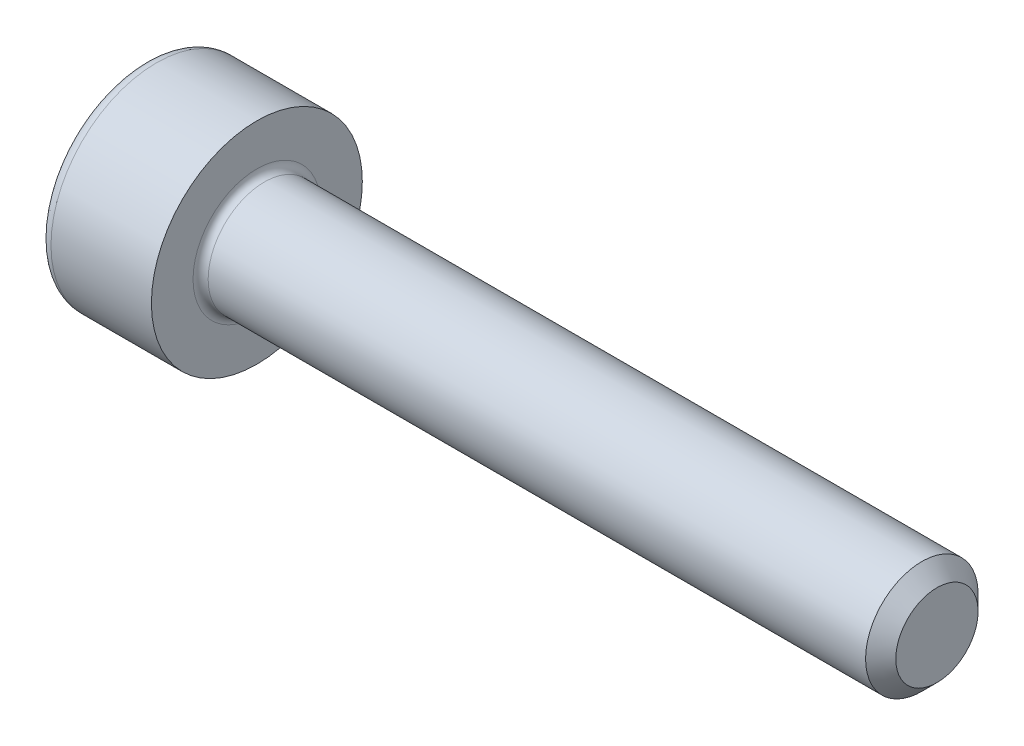
ISO-10303-21;
HEADER;
FILE_DESCRIPTION(('STEP AP214'),'2;1');
FILE_NAME('part.step','',(''),(''),'','','');
FILE_SCHEMA(('AUTOMOTIVE_DESIGN { 1 0 10303 214 1 1 1 1 }'));
ENDSEC;
DATA;
#1=APPLICATION_CONTEXT('core data for automotive mechanical design processes');
#2=APPLICATION_PROTOCOL_DEFINITION('international standard','automotive_design',2000,#1);
#3=PRODUCT_CONTEXT('',#1,'mechanical');
#4=PRODUCT('Part','Part','',(#3));
#5=PRODUCT_RELATED_PRODUCT_CATEGORY('part','',(#4));
#6=PRODUCT_DEFINITION_FORMATION('','',#4);
#7=PRODUCT_DEFINITION_CONTEXT('part definition',#1,'design');
#8=PRODUCT_DEFINITION('design','',#6,#7);
#9=PRODUCT_DEFINITION_SHAPE('','',#8);
#10=(LENGTH_UNIT() NAMED_UNIT(*) SI_UNIT(.MILLI.,.METRE.));
#11=(NAMED_UNIT(*) PLANE_ANGLE_UNIT() SI_UNIT($,.RADIAN.));
#12=(NAMED_UNIT(*) SI_UNIT($,.STERADIAN.) SOLID_ANGLE_UNIT());
#13=UNCERTAINTY_MEASURE_WITH_UNIT(LENGTH_MEASURE(1.E-05),#10,'distance_accuracy_value','');
#14=(GEOMETRIC_REPRESENTATION_CONTEXT(3) GLOBAL_UNCERTAINTY_ASSIGNED_CONTEXT((#13)) GLOBAL_UNIT_ASSIGNED_CONTEXT((#10,
#11,#12)) REPRESENTATION_CONTEXT('',''));
#15=CARTESIAN_POINT('',(0.,0.,0.));
#16=DIRECTION('',(0.,0.,1.));
#17=DIRECTION('',(1.,0.,0.));
#18=AXIS2_PLACEMENT_3D('',#15,#16,#17);
#19=CARTESIAN_POINT('',(0.,0.,0.));
#20=DIRECTION('',(-1.,0.,0.));
#21=DIRECTION('',(0.,0.,1.));
#22=AXIS2_PLACEMENT_3D('',#19,#20,#21);
#23=CYLINDRICAL_SURFACE('',#22,1.39568824458778);
#24=CARTESIAN_POINT('',(0.16,0.,0.));
#25=DIRECTION('',(1.,0.,0.));
#26=DIRECTION('',(0.,0.,-1.));
#27=AXIS2_PLACEMENT_3D('',#24,#25,#26);
#28=CIRCLE('',#27,1.39568824458778);
#29=CARTESIAN_POINT('',(0.16,0.,-1.39568824458778));
#30=VERTEX_POINT('',#29);
#31=EDGE_CURVE('E158',#30,#30,#28,.T.);
#32=ORIENTED_EDGE('',*,*,#31,.T.);
#33=EDGE_LOOP('',(#32));
#34=FACE_BOUND('',#33,.T.);
#35=CARTESIAN_POINT('',(1.48873412756029,0.,0.));
#36=DIRECTION('',(-1.,0.,0.));
#37=DIRECTION('',(0.,0.,1.));
#38=AXIS2_PLACEMENT_3D('',#35,#36,#37);
#39=CIRCLE('',#38,1.39568824458778);
#40=CARTESIAN_POINT('',(1.48873412756029,0.,1.39568824458778));
#41=VERTEX_POINT('',#40);
#42=EDGE_CURVE('E141',#41,#41,#39,.T.);
#43=ORIENTED_EDGE('',*,*,#42,.T.);
#44=EDGE_LOOP('',(#43));
#45=FACE_BOUND('',#44,.T.);
#46=ADVANCED_FACE('F39',(#34,#45),#23,.T.);
#47=CARTESIAN_POINT('',(0.,0.,0.));
#48=DIRECTION('',(1.,0.,0.));
#49=DIRECTION('',(0.,0.,-1.));
#50=AXIS2_PLACEMENT_3D('',#47,#48,#49);
#51=PLANE('',#50);
#52=DIRECTION('',(0.,-0.5,-0.866025403784439));
#53=VECTOR('',#52,1.);
#54=CARTESIAN_POINT('',(0.,0.877572409168232,0.));
#55=LINE('',#54,#53);
#56=CARTESIAN_POINT('',(0.,0.877572409168232,0.));
#57=VERTEX_POINT('',#56);
#58=CARTESIAN_POINT('',(0.,0.438786204584116,-0.760000000000001));
#59=VERTEX_POINT('',#58);
#60=EDGE_CURVE('E128',#57,#59,#55,.T.);
#61=ORIENTED_EDGE('',*,*,#60,.F.);
#62=DIRECTION('',(0.,0.5,-0.866025403784439));
#63=VECTOR('',#62,1.);
#64=CARTESIAN_POINT('',(0.,0.438786204584116,0.76));
#65=LINE('',#64,#63);
#66=CARTESIAN_POINT('',(0.,0.438786204584116,0.76));
#67=VERTEX_POINT('',#66);
#68=EDGE_CURVE('E54',#67,#57,#65,.T.);
#69=ORIENTED_EDGE('',*,*,#68,.F.);
#70=DIRECTION('',(0.,1.,0.));
#71=VECTOR('',#70,1.);
#72=CARTESIAN_POINT('',(0.,-0.438786204584116,0.76));
#73=LINE('',#72,#71);
#74=CARTESIAN_POINT('',(0.,-0.438786204584116,0.76));
#75=VERTEX_POINT('',#74);
#76=EDGE_CURVE('E137',#75,#67,#73,.T.);
#77=ORIENTED_EDGE('',*,*,#76,.F.);
#78=DIRECTION('',(0.,0.5,0.866025403784439));
#79=VECTOR('',#78,1.);
#80=CARTESIAN_POINT('',(0.,-0.877572409168232,0.));
#81=LINE('',#80,#79);
#82=CARTESIAN_POINT('',(0.,-0.877572409168232,0.));
#83=VERTEX_POINT('',#82);
#84=EDGE_CURVE('E135',#83,#75,#81,.T.);
#85=ORIENTED_EDGE('',*,*,#84,.F.);
#86=DIRECTION('',(0.,-0.5,0.866025403784438));
#87=VECTOR('',#86,1.);
#88=CARTESIAN_POINT('',(0.,-0.438786204584116,-0.760000000000001));
#89=LINE('',#88,#87);
#90=CARTESIAN_POINT('',(0.,-0.438786204584116,-0.760000000000001));
#91=VERTEX_POINT('',#90);
#92=EDGE_CURVE('E102',#91,#83,#89,.T.);
#93=ORIENTED_EDGE('',*,*,#92,.F.);
#94=DIRECTION('',(0.,-1.,0.));
#95=VECTOR('',#94,1.);
#96=CARTESIAN_POINT('',(0.,0.438786204584116,-0.760000000000001));
#97=LINE('',#96,#95);
#98=EDGE_CURVE('E131',#59,#91,#97,.T.);
#99=ORIENTED_EDGE('',*,*,#98,.F.);
#100=EDGE_LOOP('',(#61,#69,#77,#85,#93,#99));
#101=FACE_BOUND('',#100,.T.);
#102=CARTESIAN_POINT('',(0.,0.,0.));
#103=DIRECTION('',(1.,0.,0.));
#104=DIRECTION('',(0.,0.,-1.));
#105=AXIS2_PLACEMENT_3D('',#102,#103,#104);
#106=CIRCLE('',#105,1.23568824458778);
#107=CARTESIAN_POINT('',(0.,0.,-1.23568824458778));
#108=VERTEX_POINT('',#107);
#109=EDGE_CURVE('E155',#108,#108,#106,.F.);
#110=ORIENTED_EDGE('',*,*,#109,.T.);
#111=EDGE_LOOP('',(#110));
#112=FACE_BOUND('',#111,.T.);
#113=ADVANCED_FACE('F180',(#101,#112),#51,.F.);
#114=CARTESIAN_POINT('',(10.4887341275603,0.,0.));
#115=DIRECTION('',(-1.,0.,0.));
#116=DIRECTION('',(0.,0.,1.));
#117=AXIS2_PLACEMENT_3D('',#114,#115,#116);
#118=PLANE('',#117);
#119=CARTESIAN_POINT('',(10.4887341275603,0.,0.));
#120=DIRECTION('',(-1.,0.,0.));
#121=DIRECTION('',(0.,0.,1.));
#122=AXIS2_PLACEMENT_3D('',#119,#120,#121);
#123=CIRCLE('',#122,0.544367063780148);
#124=CARTESIAN_POINT('',(10.4887341275603,0.,0.544367063780148));
#125=VERTEX_POINT('',#124);
#126=EDGE_CURVE('E11',#125,#125,#123,.F.);
#127=ORIENTED_EDGE('',*,*,#126,.T.);
#128=EDGE_LOOP('',(#127));
#129=FACE_BOUND('',#128,.T.);
#130=ADVANCED_FACE('F186',(#129),#118,.F.);
#131=CARTESIAN_POINT('',(0.,0.,0.));
#132=DIRECTION('',(-1.,0.,0.));
#133=DIRECTION('',(0.,0.,1.));
#134=AXIS2_PLACEMENT_3D('',#131,#132,#133);
#135=CYLINDRICAL_SURFACE('',#134,0.744367063780147);
#136=CARTESIAN_POINT('',(10.2887341275603,0.,0.));
#137=DIRECTION('',(-1.,0.,0.));
#138=DIRECTION('',(0.,0.,1.));
#139=AXIS2_PLACEMENT_3D('',#136,#137,#138);
#140=CIRCLE('',#139,0.744367063780147);
#141=CARTESIAN_POINT('',(10.2887341275603,0.,0.744367063780147));
#142=VERTEX_POINT('',#141);
#143=EDGE_CURVE('E47',#142,#142,#140,.T.);
#144=ORIENTED_EDGE('',*,*,#143,.T.);
#145=EDGE_LOOP('',(#144));
#146=FACE_BOUND('',#145,.T.);
#147=CARTESIAN_POINT('',(1.58873412756029,0.,0.));
#148=DIRECTION('',(-1.,0.,0.));
#149=DIRECTION('',(0.,0.,1.));
#150=AXIS2_PLACEMENT_3D('',#147,#148,#149);
#151=CIRCLE('',#150,0.744367063780147);
#152=CARTESIAN_POINT('',(1.58873412756029,0.,0.744367063780147));
#153=VERTEX_POINT('',#152);
#154=EDGE_CURVE('E152',#153,#153,#151,.F.);
#155=ORIENTED_EDGE('',*,*,#154,.T.);
#156=EDGE_LOOP('',(#155));
#157=FACE_BOUND('',#156,.T.);
#158=ADVANCED_FACE('F163',(#146,#157),#135,.T.);
#159=CARTESIAN_POINT('',(1.48873412756029,0.,0.));
#160=DIRECTION('',(-1.,0.,0.));
#161=DIRECTION('',(0.,0.,1.));
#162=AXIS2_PLACEMENT_3D('',#159,#160,#161);
#163=PLANE('',#162);
#164=CARTESIAN_POINT('',(1.48873412756029,0.,0.));
#165=DIRECTION('',(-1.,0.,0.));
#166=DIRECTION('',(0.,0.,1.));
#167=AXIS2_PLACEMENT_3D('',#164,#165,#166);
#168=CIRCLE('',#167,0.844367063780147);
#169=CARTESIAN_POINT('',(1.48873412756029,0.,0.844367063780147));
#170=VERTEX_POINT('',#169);
#171=EDGE_CURVE('E149',#170,#170,#168,.T.);
#172=ORIENTED_EDGE('',*,*,#171,.T.);
#173=EDGE_LOOP('',(#172));
#174=FACE_BOUND('',#173,.T.);
#175=ORIENTED_EDGE('',*,*,#42,.F.);
#176=EDGE_LOOP('',(#175));
#177=FACE_BOUND('',#176,.T.);
#178=ADVANCED_FACE('F193',(#174,#177),#163,.F.);
#179=CARTESIAN_POINT('',(1.58873412756029,0.,0.));
#180=DIRECTION('',(-1.,0.,0.));
#181=DIRECTION('',(0.,0.,1.));
#182=AXIS2_PLACEMENT_3D('',#179,#180,#181);
#183=TOROIDAL_SURFACE('',#182,0.844367063780147,0.1);
#184=ORIENTED_EDGE('',*,*,#154,.F.);
#185=EDGE_LOOP('',(#184));
#186=FACE_BOUND('',#185,.T.);
#187=ORIENTED_EDGE('',*,*,#171,.F.);
#188=EDGE_LOOP('',(#187));
#189=FACE_BOUND('',#188,.T.);
#190=ADVANCED_FACE('F176',(#186,#189),#183,.F.);
#191=CARTESIAN_POINT('',(0.16,0.,0.));
#192=DIRECTION('',(1.,0.,0.));
#193=DIRECTION('',(0.,0.,-1.));
#194=AXIS2_PLACEMENT_3D('',#191,#192,#193);
#195=TOROIDAL_SURFACE('',#194,1.23568824458778,0.16);
#196=ORIENTED_EDGE('',*,*,#31,.F.);
#197=EDGE_LOOP('',(#196));
#198=FACE_BOUND('',#197,.T.);
#199=ORIENTED_EDGE('',*,*,#109,.F.);
#200=EDGE_LOOP('',(#199));
#201=FACE_BOUND('',#200,.T.);
#202=ADVANCED_FACE('F168',(#198,#201),#195,.T.);
#203=CARTESIAN_POINT('',(10.2887341275603,0.,0.));
#204=DIRECTION('',(-1.,0.,0.));
#205=DIRECTION('',(0.,0.,1.));
#206=AXIS2_PLACEMENT_3D('',#203,#204,#205);
#207=CONICAL_SURFACE('',#206,0.744367063780147,0.785398163397448);
#208=ORIENTED_EDGE('',*,*,#126,.F.);
#209=EDGE_LOOP('',(#208));
#210=FACE_BOUND('',#209,.T.);
#211=ORIENTED_EDGE('',*,*,#143,.F.);
#212=EDGE_LOOP('',(#211));
#213=FACE_BOUND('',#212,.T.);
#214=ADVANCED_FACE('F41',(#210,#213),#207,.T.);
#215=CARTESIAN_POINT('',(0.7,0.438786204584116,0.76));
#216=DIRECTION('',(0.,0.866025403784439,0.5));
#217=DIRECTION('',(0.,-0.5,0.866025403784439));
#218=AXIS2_PLACEMENT_3D('',#215,#216,#217);
#219=PLANE('',#218);
#220=ORIENTED_EDGE('',*,*,#68,.T.);
#221=DIRECTION('',(-1.,0.,0.));
#222=VECTOR('',#221,1.);
#223=CARTESIAN_POINT('',(0.7,0.877572409168232,0.));
#224=LINE('',#223,#222);
#225=CARTESIAN_POINT('',(0.7,0.877572409168232,0.));
#226=VERTEX_POINT('',#225);
#227=EDGE_CURVE('E84',#226,#57,#224,.T.);
#228=ORIENTED_EDGE('',*,*,#227,.F.);
#229=DIRECTION('',(0.,0.5,-0.866025403784439));
#230=VECTOR('',#229,1.);
#231=CARTESIAN_POINT('',(0.7,0.438786204584116,0.76));
#232=LINE('',#231,#230);
#233=CARTESIAN_POINT('',(0.7,0.438786204584116,0.76));
#234=VERTEX_POINT('',#233);
#235=EDGE_CURVE('E139',#234,#226,#232,.T.);
#236=ORIENTED_EDGE('',*,*,#235,.F.);
#237=DIRECTION('',(-1.,0.,0.));
#238=VECTOR('',#237,1.);
#239=CARTESIAN_POINT('',(0.7,0.438786204584116,0.76));
#240=LINE('',#239,#238);
#241=EDGE_CURVE('E62',#234,#67,#240,.T.);
#242=ORIENTED_EDGE('',*,*,#241,.T.);
#243=EDGE_LOOP('',(#220,#228,#236,#242));
#244=FACE_BOUND('',#243,.T.);
#245=ADVANCED_FACE('F167',(#244),#219,.F.);
#246=CARTESIAN_POINT('',(0.7,-0.438786204584116,0.76));
#247=DIRECTION('',(0.,0.,1.));
#248=DIRECTION('',(1.,0.,0.));
#249=AXIS2_PLACEMENT_3D('',#246,#247,#248);
#250=PLANE('',#249);
#251=ORIENTED_EDGE('',*,*,#76,.T.);
#252=ORIENTED_EDGE('',*,*,#241,.F.);
#253=DIRECTION('',(0.,1.,0.));
#254=VECTOR('',#253,1.);
#255=CARTESIAN_POINT('',(0.7,-0.438786204584116,0.76));
#256=LINE('',#255,#254);
#257=CARTESIAN_POINT('',(0.7,-0.438786204584116,0.76));
#258=VERTEX_POINT('',#257);
#259=EDGE_CURVE('E114',#258,#234,#256,.T.);
#260=ORIENTED_EDGE('',*,*,#259,.F.);
#261=DIRECTION('',(-1.,0.,0.));
#262=VECTOR('',#261,1.);
#263=CARTESIAN_POINT('',(0.7,-0.438786204584116,0.76));
#264=LINE('',#263,#262);
#265=EDGE_CURVE('E106',#258,#75,#264,.T.);
#266=ORIENTED_EDGE('',*,*,#265,.T.);
#267=EDGE_LOOP('',(#251,#252,#260,#266));
#268=FACE_BOUND('',#267,.T.);
#269=ADVANCED_FACE('F174',(#268),#250,.F.);
#270=CARTESIAN_POINT('',(0.7,-0.877572409168232,0.));
#271=DIRECTION('',(0.,-0.866025403784439,0.5));
#272=DIRECTION('',(0.,-0.5,-0.866025403784439));
#273=AXIS2_PLACEMENT_3D('',#270,#271,#272);
#274=PLANE('',#273);
#275=ORIENTED_EDGE('',*,*,#84,.T.);
#276=ORIENTED_EDGE('',*,*,#265,.F.);
#277=DIRECTION('',(0.,0.5,0.866025403784439));
#278=VECTOR('',#277,1.);
#279=CARTESIAN_POINT('',(0.7,-0.877572409168232,0.));
#280=LINE('',#279,#278);
#281=CARTESIAN_POINT('',(0.7,-0.877572409168232,0.));
#282=VERTEX_POINT('',#281);
#283=EDGE_CURVE('E110',#282,#258,#280,.T.);
#284=ORIENTED_EDGE('',*,*,#283,.F.);
#285=DIRECTION('',(-1.,0.,0.));
#286=VECTOR('',#285,1.);
#287=CARTESIAN_POINT('',(0.7,-0.877572409168232,0.));
#288=LINE('',#287,#286);
#289=EDGE_CURVE('E95',#282,#83,#288,.T.);
#290=ORIENTED_EDGE('',*,*,#289,.T.);
#291=EDGE_LOOP('',(#275,#276,#284,#290));
#292=FACE_BOUND('',#291,.T.);
#293=ADVANCED_FACE('F111',(#292),#274,.F.);
#294=CARTESIAN_POINT('',(0.7,-0.438786204584116,-0.760000000000001));
#295=DIRECTION('',(0.,-0.866025403784438,-0.5));
#296=DIRECTION('',(0.,0.5,-0.866025403784438));
#297=AXIS2_PLACEMENT_3D('',#294,#295,#296);
#298=PLANE('',#297);
#299=ORIENTED_EDGE('',*,*,#92,.T.);
#300=ORIENTED_EDGE('',*,*,#289,.F.);
#301=DIRECTION('',(0.,-0.5,0.866025403784438));
#302=VECTOR('',#301,1.);
#303=CARTESIAN_POINT('',(0.7,-0.438786204584116,-0.760000000000001));
#304=LINE('',#303,#302);
#305=CARTESIAN_POINT('',(0.7,-0.438786204584116,-0.760000000000001));
#306=VERTEX_POINT('',#305);
#307=EDGE_CURVE('E99',#306,#282,#304,.T.);
#308=ORIENTED_EDGE('',*,*,#307,.F.);
#309=DIRECTION('',(-1.,0.,0.));
#310=VECTOR('',#309,1.);
#311=CARTESIAN_POINT('',(0.7,-0.438786204584116,-0.760000000000001));
#312=LINE('',#311,#310);
#313=EDGE_CURVE('E107',#306,#91,#312,.T.);
#314=ORIENTED_EDGE('',*,*,#313,.T.);
#315=EDGE_LOOP('',(#299,#300,#308,#314));
#316=FACE_BOUND('',#315,.T.);
#317=ADVANCED_FACE('F97',(#316),#298,.F.);
#318=CARTESIAN_POINT('',(0.7,0.438786204584116,-0.760000000000001));
#319=DIRECTION('',(0.,0.,-1.));
#320=DIRECTION('',(0.,1.,0.));
#321=AXIS2_PLACEMENT_3D('',#318,#319,#320);
#322=PLANE('',#321);
#323=ORIENTED_EDGE('',*,*,#98,.T.);
#324=ORIENTED_EDGE('',*,*,#313,.F.);
#325=DIRECTION('',(0.,-1.,0.));
#326=VECTOR('',#325,1.);
#327=CARTESIAN_POINT('',(0.7,0.438786204584116,-0.760000000000001));
#328=LINE('',#327,#326);
#329=CARTESIAN_POINT('',(0.7,0.438786204584116,-0.760000000000001));
#330=VERTEX_POINT('',#329);
#331=EDGE_CURVE('E120',#330,#306,#328,.T.);
#332=ORIENTED_EDGE('',*,*,#331,.F.);
#333=DIRECTION('',(-1.,0.,0.));
#334=VECTOR('',#333,1.);
#335=CARTESIAN_POINT('',(0.7,0.438786204584116,-0.760000000000001));
#336=LINE('',#335,#334);
#337=EDGE_CURVE('E144',#330,#59,#336,.T.);
#338=ORIENTED_EDGE('',*,*,#337,.T.);
#339=EDGE_LOOP('',(#323,#324,#332,#338));
#340=FACE_BOUND('',#339,.T.);
#341=ADVANCED_FACE('F215',(#340),#322,.F.);
#342=CARTESIAN_POINT('',(0.7,0.877572409168232,0.));
#343=DIRECTION('',(0.,0.866025403784439,-0.5));
#344=DIRECTION('',(0.,0.5,0.866025403784439));
#345=AXIS2_PLACEMENT_3D('',#342,#343,#344);
#346=PLANE('',#345);
#347=ORIENTED_EDGE('',*,*,#60,.T.);
#348=ORIENTED_EDGE('',*,*,#337,.F.);
#349=DIRECTION('',(0.,-0.5,-0.866025403784439));
#350=VECTOR('',#349,1.);
#351=CARTESIAN_POINT('',(0.7,0.877572409168232,0.));
#352=LINE('',#351,#350);
#353=EDGE_CURVE('E122',#226,#330,#352,.T.);
#354=ORIENTED_EDGE('',*,*,#353,.F.);
#355=ORIENTED_EDGE('',*,*,#227,.T.);
#356=EDGE_LOOP('',(#347,#348,#354,#355));
#357=FACE_BOUND('',#356,.T.);
#358=ADVANCED_FACE('F212',(#357),#346,.F.);
#359=CARTESIAN_POINT('',(0.7,0.,0.));
#360=DIRECTION('',(-1.,0.,0.));
#361=DIRECTION('',(0.,0.,1.));
#362=AXIS2_PLACEMENT_3D('',#359,#360,#361);
#363=PLANE('',#362);
#364=ORIENTED_EDGE('',*,*,#235,.T.);
#365=ORIENTED_EDGE('',*,*,#353,.T.);
#366=ORIENTED_EDGE('',*,*,#331,.T.);
#367=ORIENTED_EDGE('',*,*,#307,.T.);
#368=ORIENTED_EDGE('',*,*,#283,.T.);
#369=ORIENTED_EDGE('',*,*,#259,.T.);
#370=EDGE_LOOP('',(#364,#365,#366,#367,#368,#369));
#371=FACE_BOUND('',#370,.T.);
#372=ADVANCED_FACE('F117',(#371),#363,.T.);
#373=CLOSED_SHELL('',(#46,#113,#130,#158,#178,#190,#202,#214,#245,#269,#293,#317,#341,#358,#372));
#374=MANIFOLD_SOLID_BREP('B2',#373);
#375=ADVANCED_BREP_SHAPE_REPRESENTATION('',(#18,#374),#14);
#376=SHAPE_DEFINITION_REPRESENTATION(#9,#375);
ENDSEC;
END-ISO-10303-21;
